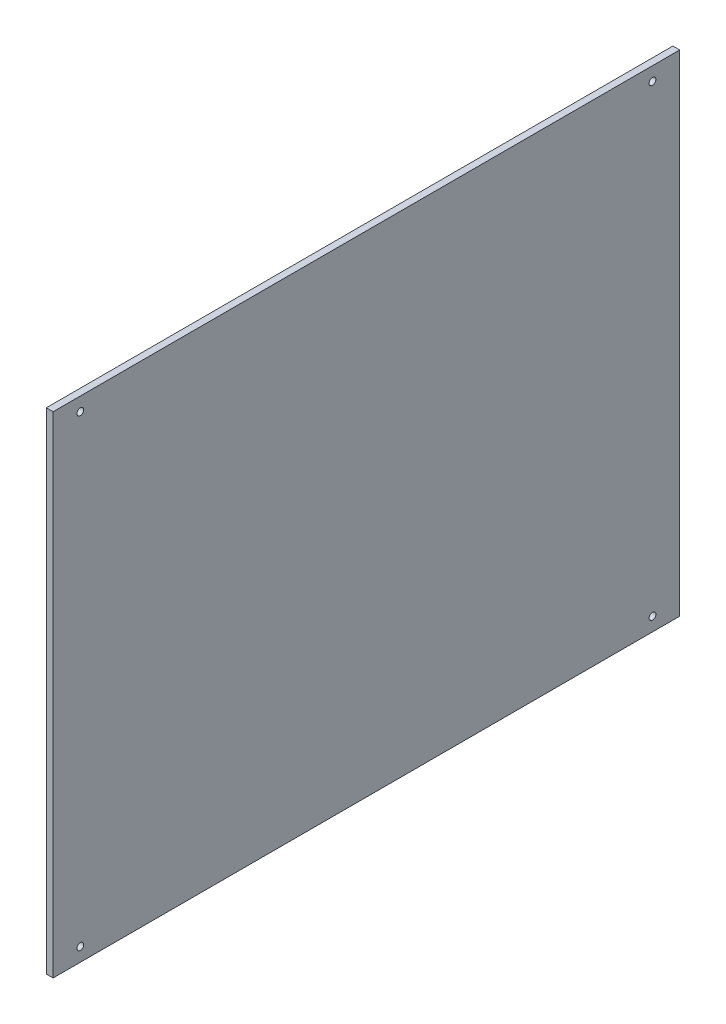
ISO-10303-21;
HEADER;
FILE_DESCRIPTION(('STEP AP214'),'2;1');
FILE_NAME('part.step','',(''),(''),'','','');
FILE_SCHEMA(('AUTOMOTIVE_DESIGN { 1 0 10303 214 1 1 1 1 }'));
ENDSEC;
DATA;
#1=APPLICATION_CONTEXT('core data for automotive mechanical design processes');
#2=APPLICATION_PROTOCOL_DEFINITION('international standard','automotive_design',2000,#1);
#3=PRODUCT_CONTEXT('',#1,'mechanical');
#4=PRODUCT('Part','Part','',(#3));
#5=PRODUCT_RELATED_PRODUCT_CATEGORY('part','',(#4));
#6=PRODUCT_DEFINITION_FORMATION('','',#4);
#7=PRODUCT_DEFINITION_CONTEXT('part definition',#1,'design');
#8=PRODUCT_DEFINITION('design','',#6,#7);
#9=PRODUCT_DEFINITION_SHAPE('','',#8);
#10=(LENGTH_UNIT() NAMED_UNIT(*) SI_UNIT(.MILLI.,.METRE.));
#11=(NAMED_UNIT(*) PLANE_ANGLE_UNIT() SI_UNIT($,.RADIAN.));
#12=(NAMED_UNIT(*) SI_UNIT($,.STERADIAN.) SOLID_ANGLE_UNIT());
#13=UNCERTAINTY_MEASURE_WITH_UNIT(LENGTH_MEASURE(1.E-05),#10,'distance_accuracy_value','');
#14=(GEOMETRIC_REPRESENTATION_CONTEXT(3) GLOBAL_UNCERTAINTY_ASSIGNED_CONTEXT((#13)) GLOBAL_UNIT_ASSIGNED_CONTEXT((#10,
#11,#12)) REPRESENTATION_CONTEXT('',''));
#15=CARTESIAN_POINT('',(0.,0.,0.));
#16=DIRECTION('',(0.,0.,1.));
#17=DIRECTION('',(1.,0.,0.));
#18=AXIS2_PLACEMENT_3D('',#15,#16,#17);
#19=CARTESIAN_POINT('',(3.175,114.3,146.05));
#20=DIRECTION('',(0.,0.,-1.));
#21=DIRECTION('',(0.,1.,0.));
#22=AXIS2_PLACEMENT_3D('',#19,#20,#21);
#23=PLANE('',#22);
#24=DIRECTION('',(0.,-1.,0.));
#25=VECTOR('',#24,1.);
#26=CARTESIAN_POINT('',(0.,114.3,146.05));
#27=LINE('',#26,#25);
#28=CARTESIAN_POINT('',(0.,114.3,146.05));
#29=VERTEX_POINT('',#28);
#30=CARTESIAN_POINT('',(0.,-114.3,146.05));
#31=VERTEX_POINT('',#30);
#32=EDGE_CURVE('E107',#29,#31,#27,.T.);
#33=ORIENTED_EDGE('',*,*,#32,.T.);
#34=DIRECTION('',(-1.,0.,0.));
#35=VECTOR('',#34,1.);
#36=CARTESIAN_POINT('',(3.175,-114.3,146.05));
#37=LINE('',#36,#35);
#38=CARTESIAN_POINT('',(3.175,-114.3,146.05));
#39=VERTEX_POINT('',#38);
#40=EDGE_CURVE('E11',#39,#31,#37,.T.);
#41=ORIENTED_EDGE('',*,*,#40,.F.);
#42=DIRECTION('',(0.,-1.,0.));
#43=VECTOR('',#42,1.);
#44=CARTESIAN_POINT('',(3.175,114.3,146.05));
#45=LINE('',#44,#43);
#46=CARTESIAN_POINT('',(3.175,114.3,146.05));
#47=VERTEX_POINT('',#46);
#48=EDGE_CURVE('E91',#47,#39,#45,.T.);
#49=ORIENTED_EDGE('',*,*,#48,.F.);
#50=DIRECTION('',(-1.,0.,0.));
#51=VECTOR('',#50,1.);
#52=CARTESIAN_POINT('',(3.175,114.3,146.05));
#53=LINE('',#52,#51);
#54=EDGE_CURVE('E103',#47,#29,#53,.T.);
#55=ORIENTED_EDGE('',*,*,#54,.T.);
#56=EDGE_LOOP('',(#33,#41,#49,#55));
#57=FACE_BOUND('',#56,.T.);
#58=ADVANCED_FACE('F39',(#57),#23,.F.);
#59=CARTESIAN_POINT('',(3.175,-114.3,-146.05));
#60=DIRECTION('',(0.,1.,0.));
#61=DIRECTION('',(0.,0.,1.));
#62=AXIS2_PLACEMENT_3D('',#59,#60,#61);
#63=PLANE('',#62);
#64=DIRECTION('',(0.,0.,-1.));
#65=VECTOR('',#64,1.);
#66=CARTESIAN_POINT('',(0.,-114.3,-146.05));
#67=LINE('',#66,#65);
#68=CARTESIAN_POINT('',(0.,-114.3,-146.05));
#69=VERTEX_POINT('',#68);
#70=EDGE_CURVE('E96',#31,#69,#67,.T.);
#71=ORIENTED_EDGE('',*,*,#70,.T.);
#72=DIRECTION('',(-1.,0.,0.));
#73=VECTOR('',#72,1.);
#74=CARTESIAN_POINT('',(3.175,-114.3,-146.05));
#75=LINE('',#74,#73);
#76=CARTESIAN_POINT('',(3.175,-114.3,-146.05));
#77=VERTEX_POINT('',#76);
#78=EDGE_CURVE('E48',#77,#69,#75,.T.);
#79=ORIENTED_EDGE('',*,*,#78,.F.);
#80=DIRECTION('',(0.,0.,-1.));
#81=VECTOR('',#80,1.);
#82=CARTESIAN_POINT('',(3.175,-114.3,-146.05));
#83=LINE('',#82,#81);
#84=EDGE_CURVE('E86',#39,#77,#83,.T.);
#85=ORIENTED_EDGE('',*,*,#84,.F.);
#86=ORIENTED_EDGE('',*,*,#40,.T.);
#87=EDGE_LOOP('',(#71,#79,#85,#86));
#88=FACE_BOUND('',#87,.T.);
#89=ADVANCED_FACE('F95',(#88),#63,.F.);
#90=CARTESIAN_POINT('',(3.175,114.3,-146.05));
#91=DIRECTION('',(0.,0.,1.));
#92=DIRECTION('',(0.,-1.,0.));
#93=AXIS2_PLACEMENT_3D('',#90,#91,#92);
#94=PLANE('',#93);
#95=DIRECTION('',(0.,1.,0.));
#96=VECTOR('',#95,1.);
#97=CARTESIAN_POINT('',(0.,114.3,-146.05));
#98=LINE('',#97,#96);
#99=CARTESIAN_POINT('',(0.,114.3,-146.05));
#100=VERTEX_POINT('',#99);
#101=EDGE_CURVE('E73',#69,#100,#98,.T.);
#102=ORIENTED_EDGE('',*,*,#101,.T.);
#103=DIRECTION('',(-1.,0.,0.));
#104=VECTOR('',#103,1.);
#105=CARTESIAN_POINT('',(3.175,114.3,-146.05));
#106=LINE('',#105,#104);
#107=CARTESIAN_POINT('',(3.175,114.3,-146.05));
#108=VERTEX_POINT('',#107);
#109=EDGE_CURVE('E98',#108,#100,#106,.T.);
#110=ORIENTED_EDGE('',*,*,#109,.F.);
#111=DIRECTION('',(0.,1.,0.));
#112=VECTOR('',#111,1.);
#113=CARTESIAN_POINT('',(3.175,114.3,-146.05));
#114=LINE('',#113,#112);
#115=EDGE_CURVE('E89',#77,#108,#114,.T.);
#116=ORIENTED_EDGE('',*,*,#115,.F.);
#117=ORIENTED_EDGE('',*,*,#78,.T.);
#118=EDGE_LOOP('',(#102,#110,#116,#117));
#119=FACE_BOUND('',#118,.T.);
#120=ADVANCED_FACE('F99',(#119),#94,.F.);
#121=CARTESIAN_POINT('',(3.175,114.3,-146.05));
#122=DIRECTION('',(0.,-1.,0.));
#123=DIRECTION('',(0.,0.,-1.));
#124=AXIS2_PLACEMENT_3D('',#121,#122,#123);
#125=PLANE('',#124);
#126=DIRECTION('',(0.,0.,1.));
#127=VECTOR('',#126,1.);
#128=CARTESIAN_POINT('',(0.,114.3,-146.05));
#129=LINE('',#128,#127);
#130=EDGE_CURVE('E79',#100,#29,#129,.T.);
#131=ORIENTED_EDGE('',*,*,#130,.T.);
#132=ORIENTED_EDGE('',*,*,#54,.F.);
#133=DIRECTION('',(0.,0.,1.));
#134=VECTOR('',#133,1.);
#135=CARTESIAN_POINT('',(3.175,114.3,-146.05));
#136=LINE('',#135,#134);
#137=EDGE_CURVE('E56',#108,#47,#136,.T.);
#138=ORIENTED_EDGE('',*,*,#137,.F.);
#139=ORIENTED_EDGE('',*,*,#109,.T.);
#140=EDGE_LOOP('',(#131,#132,#138,#139));
#141=FACE_BOUND('',#140,.T.);
#142=ADVANCED_FACE('F121',(#141),#125,.F.);
#143=CARTESIAN_POINT('',(3.175,0.,0.));
#144=DIRECTION('',(-1.,0.,0.));
#145=DIRECTION('',(0.,0.,1.));
#146=AXIS2_PLACEMENT_3D('',#143,#144,#145);
#147=PLANE('',#146);
#148=CARTESIAN_POINT('',(3.175,-107.95,-133.35));
#149=DIRECTION('',(-1.,0.,0.));
#150=DIRECTION('',(0.,0.,1.));
#151=AXIS2_PLACEMENT_3D('',#148,#149,#150);
#152=CIRCLE('',#151,1.58749999999999);
#153=CARTESIAN_POINT('',(3.175,-107.95,-131.7625));
#154=VERTEX_POINT('',#153);
#155=EDGE_CURVE('E152',#154,#154,#152,.T.);
#156=ORIENTED_EDGE('',*,*,#155,.T.);
#157=EDGE_LOOP('',(#156));
#158=FACE_BOUND('',#157,.T.);
#159=CARTESIAN_POINT('',(3.175,107.95,-133.35));
#160=DIRECTION('',(1.,0.,0.));
#161=DIRECTION('',(0.,0.,1.));
#162=AXIS2_PLACEMENT_3D('',#159,#160,#161);
#163=CIRCLE('',#162,1.58749999999999);
#164=CARTESIAN_POINT('',(3.175,107.95,-131.7625));
#165=VERTEX_POINT('',#164);
#166=EDGE_CURVE('E144',#165,#165,#163,.T.);
#167=ORIENTED_EDGE('',*,*,#166,.F.);
#168=EDGE_LOOP('',(#167));
#169=FACE_BOUND('',#168,.T.);
#170=CARTESIAN_POINT('',(3.175,107.95,133.35));
#171=DIRECTION('',(-1.,0.,0.));
#172=DIRECTION('',(0.,0.,-1.));
#173=AXIS2_PLACEMENT_3D('',#170,#171,#172);
#174=CIRCLE('',#173,1.58749999999999);
#175=CARTESIAN_POINT('',(3.175,107.95,131.7625));
#176=VERTEX_POINT('',#175);
#177=EDGE_CURVE('E136',#176,#176,#174,.T.);
#178=ORIENTED_EDGE('',*,*,#177,.T.);
#179=EDGE_LOOP('',(#178));
#180=FACE_BOUND('',#179,.T.);
#181=CARTESIAN_POINT('',(3.175,-107.95,133.35));
#182=DIRECTION('',(1.,0.,0.));
#183=DIRECTION('',(0.,0.,-1.));
#184=AXIS2_PLACEMENT_3D('',#181,#182,#183);
#185=CIRCLE('',#184,1.58749999999999);
#186=CARTESIAN_POINT('',(3.175,-107.95,131.7625));
#187=VERTEX_POINT('',#186);
#188=EDGE_CURVE('E128',#187,#187,#185,.T.);
#189=ORIENTED_EDGE('',*,*,#188,.F.);
#190=EDGE_LOOP('',(#189));
#191=FACE_BOUND('',#190,.T.);
#192=ORIENTED_EDGE('',*,*,#48,.T.);
#193=ORIENTED_EDGE('',*,*,#84,.T.);
#194=ORIENTED_EDGE('',*,*,#115,.T.);
#195=ORIENTED_EDGE('',*,*,#137,.T.);
#196=EDGE_LOOP('',(#192,#193,#194,#195));
#197=FACE_BOUND('',#196,.T.);
#198=ADVANCED_FACE('F87',(#158,#169,#180,#191,#197),#147,.F.);
#199=CARTESIAN_POINT('',(0.,0.,0.));
#200=DIRECTION('',(-1.,0.,0.));
#201=DIRECTION('',(0.,0.,1.));
#202=AXIS2_PLACEMENT_3D('',#199,#200,#201);
#203=PLANE('',#202);
#204=CARTESIAN_POINT('',(0.,-107.95,-133.35));
#205=DIRECTION('',(-1.,0.,0.));
#206=DIRECTION('',(0.,0.,1.));
#207=AXIS2_PLACEMENT_3D('',#204,#205,#206);
#208=CIRCLE('',#207,1.58749999999999);
#209=CARTESIAN_POINT('',(0.,-107.95,-131.7625));
#210=VERTEX_POINT('',#209);
#211=EDGE_CURVE('E148',#210,#210,#208,.T.);
#212=ORIENTED_EDGE('',*,*,#211,.F.);
#213=EDGE_LOOP('',(#212));
#214=FACE_BOUND('',#213,.T.);
#215=CARTESIAN_POINT('',(0.,107.95,-133.35));
#216=DIRECTION('',(1.,0.,0.));
#217=DIRECTION('',(0.,0.,1.));
#218=AXIS2_PLACEMENT_3D('',#215,#216,#217);
#219=CIRCLE('',#218,1.58749999999999);
#220=CARTESIAN_POINT('',(0.,107.95,-131.7625));
#221=VERTEX_POINT('',#220);
#222=EDGE_CURVE('E140',#221,#221,#219,.T.);
#223=ORIENTED_EDGE('',*,*,#222,.T.);
#224=EDGE_LOOP('',(#223));
#225=FACE_BOUND('',#224,.T.);
#226=CARTESIAN_POINT('',(0.,107.95,133.35));
#227=DIRECTION('',(-1.,0.,0.));
#228=DIRECTION('',(0.,0.,-1.));
#229=AXIS2_PLACEMENT_3D('',#226,#227,#228);
#230=CIRCLE('',#229,1.58749999999999);
#231=CARTESIAN_POINT('',(0.,107.95,131.7625));
#232=VERTEX_POINT('',#231);
#233=EDGE_CURVE('E132',#232,#232,#230,.T.);
#234=ORIENTED_EDGE('',*,*,#233,.F.);
#235=EDGE_LOOP('',(#234));
#236=FACE_BOUND('',#235,.T.);
#237=CARTESIAN_POINT('',(0.,-107.95,133.35));
#238=DIRECTION('',(1.,0.,0.));
#239=DIRECTION('',(0.,0.,-1.));
#240=AXIS2_PLACEMENT_3D('',#237,#238,#239);
#241=CIRCLE('',#240,1.58749999999999);
#242=CARTESIAN_POINT('',(0.,-107.95,131.7625));
#243=VERTEX_POINT('',#242);
#244=EDGE_CURVE('E111',#243,#243,#241,.T.);
#245=ORIENTED_EDGE('',*,*,#244,.T.);
#246=EDGE_LOOP('',(#245));
#247=FACE_BOUND('',#246,.T.);
#248=ORIENTED_EDGE('',*,*,#32,.F.);
#249=ORIENTED_EDGE('',*,*,#130,.F.);
#250=ORIENTED_EDGE('',*,*,#101,.F.);
#251=ORIENTED_EDGE('',*,*,#70,.F.);
#252=EDGE_LOOP('',(#248,#249,#250,#251));
#253=FACE_BOUND('',#252,.T.);
#254=ADVANCED_FACE('F124',(#214,#225,#236,#247,#253),#203,.T.);
#255=CARTESIAN_POINT('',(0.,-107.95,133.35));
#256=DIRECTION('',(1.,0.,0.));
#257=DIRECTION('',(0.,0.,-1.));
#258=AXIS2_PLACEMENT_3D('',#255,#256,#257);
#259=CYLINDRICAL_SURFACE('',#258,1.58749999999999);
#260=ORIENTED_EDGE('',*,*,#244,.F.);
#261=EDGE_LOOP('',(#260));
#262=FACE_BOUND('',#261,.T.);
#263=ORIENTED_EDGE('',*,*,#188,.T.);
#264=EDGE_LOOP('',(#263));
#265=FACE_BOUND('',#264,.T.);
#266=ADVANCED_FACE('F165',(#262,#265),#259,.F.);
#267=CARTESIAN_POINT('',(0.,107.95,133.35));
#268=DIRECTION('',(1.,0.,0.));
#269=DIRECTION('',(0.,0.,-1.));
#270=AXIS2_PLACEMENT_3D('',#267,#268,#269);
#271=CYLINDRICAL_SURFACE('',#270,1.58749999999999);
#272=ORIENTED_EDGE('',*,*,#233,.T.);
#273=EDGE_LOOP('',(#272));
#274=FACE_BOUND('',#273,.T.);
#275=ORIENTED_EDGE('',*,*,#177,.F.);
#276=EDGE_LOOP('',(#275));
#277=FACE_BOUND('',#276,.T.);
#278=ADVANCED_FACE('F175',(#274,#277),#271,.F.);
#279=CARTESIAN_POINT('',(0.,107.95,-133.35));
#280=DIRECTION('',(1.,0.,0.));
#281=DIRECTION('',(0.,0.,-1.));
#282=AXIS2_PLACEMENT_3D('',#279,#280,#281);
#283=CYLINDRICAL_SURFACE('',#282,1.58749999999999);
#284=ORIENTED_EDGE('',*,*,#222,.F.);
#285=EDGE_LOOP('',(#284));
#286=FACE_BOUND('',#285,.T.);
#287=ORIENTED_EDGE('',*,*,#166,.T.);
#288=EDGE_LOOP('',(#287));
#289=FACE_BOUND('',#288,.T.);
#290=ADVANCED_FACE('F217',(#286,#289),#283,.F.);
#291=CARTESIAN_POINT('',(0.,-107.95,-133.35));
#292=DIRECTION('',(1.,0.,0.));
#293=DIRECTION('',(0.,0.,-1.));
#294=AXIS2_PLACEMENT_3D('',#291,#292,#293);
#295=CYLINDRICAL_SURFACE('',#294,1.58749999999999);
#296=ORIENTED_EDGE('',*,*,#211,.T.);
#297=EDGE_LOOP('',(#296));
#298=FACE_BOUND('',#297,.T.);
#299=ORIENTED_EDGE('',*,*,#155,.F.);
#300=EDGE_LOOP('',(#299));
#301=FACE_BOUND('',#300,.T.);
#302=ADVANCED_FACE('F160',(#298,#301),#295,.F.);
#303=CLOSED_SHELL('',(#58,#89,#120,#142,#198,#254,#266,#278,#290,#302));
#304=MANIFOLD_SOLID_BREP('B2',#303);
#305=ADVANCED_BREP_SHAPE_REPRESENTATION('',(#18,#304),#14);
#306=SHAPE_DEFINITION_REPRESENTATION(#9,#305);
ENDSEC;
END-ISO-10303-21;
